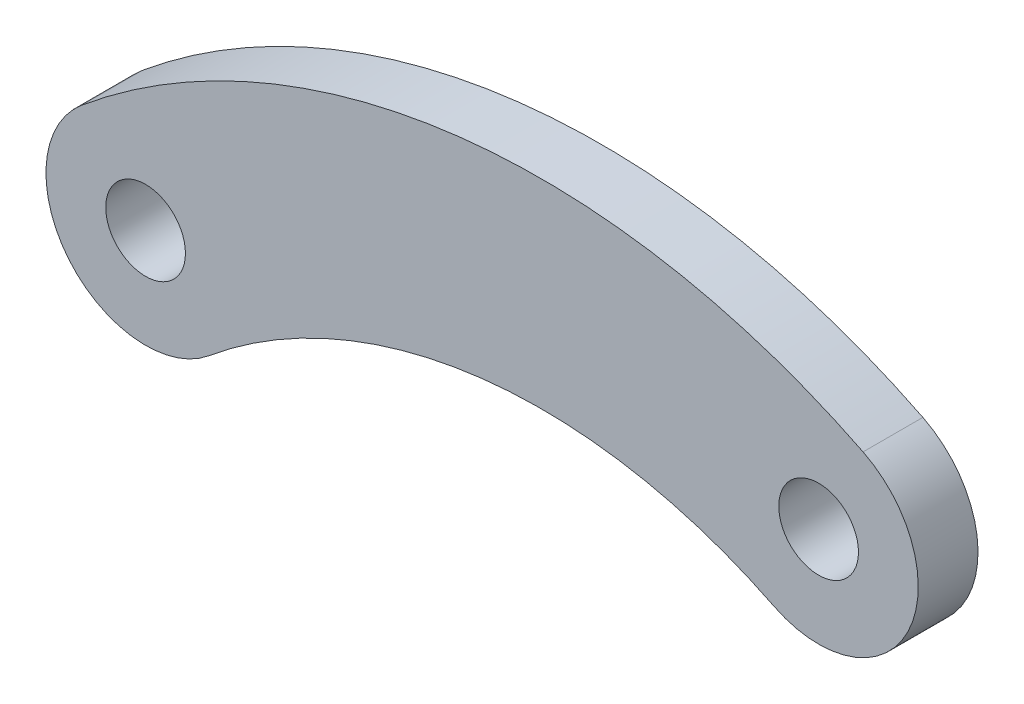
ISO-10303-21;
HEADER;
FILE_DESCRIPTION(('STEP AP214'),'2;1');
FILE_NAME('part.step','',(''),(''),'','','');
FILE_SCHEMA(('AUTOMOTIVE_DESIGN { 1 0 10303 214 1 1 1 1 }'));
ENDSEC;
DATA;
#1=APPLICATION_CONTEXT('core data for automotive mechanical design processes');
#2=APPLICATION_PROTOCOL_DEFINITION('international standard','automotive_design',2000,#1);
#3=PRODUCT_CONTEXT('',#1,'mechanical');
#4=PRODUCT('Part','Part','',(#3));
#5=PRODUCT_RELATED_PRODUCT_CATEGORY('part','',(#4));
#6=PRODUCT_DEFINITION_FORMATION('','',#4);
#7=PRODUCT_DEFINITION_CONTEXT('part definition',#1,'design');
#8=PRODUCT_DEFINITION('design','',#6,#7);
#9=PRODUCT_DEFINITION_SHAPE('','',#8);
#10=(LENGTH_UNIT() NAMED_UNIT(*) SI_UNIT(.MILLI.,.METRE.));
#11=(NAMED_UNIT(*) PLANE_ANGLE_UNIT() SI_UNIT($,.RADIAN.));
#12=(NAMED_UNIT(*) SI_UNIT($,.STERADIAN.) SOLID_ANGLE_UNIT());
#13=UNCERTAINTY_MEASURE_WITH_UNIT(LENGTH_MEASURE(1.E-05),#10,'distance_accuracy_value','');
#14=(GEOMETRIC_REPRESENTATION_CONTEXT(3) GLOBAL_UNCERTAINTY_ASSIGNED_CONTEXT((#13)) GLOBAL_UNIT_ASSIGNED_CONTEXT((#10,
#11,#12)) REPRESENTATION_CONTEXT('',''));
#15=CARTESIAN_POINT('',(0.,0.,0.));
#16=DIRECTION('',(0.,0.,1.));
#17=DIRECTION('',(1.,0.,0.));
#18=AXIS2_PLACEMENT_3D('',#15,#16,#17);
#19=CARTESIAN_POINT('',(13.4138493763877,-5.01133203779115,1.5));
#20=DIRECTION('',(0.,0.,1.));
#21=DIRECTION('',(1.,0.,0.));
#22=AXIS2_PLACEMENT_3D('',#19,#20,#21);
#23=PLANE('',#22);
#24=CARTESIAN_POINT('',(0.,0.,1.5));
#25=DIRECTION('',(0.,0.,1.));
#26=DIRECTION('',(1.,0.,0.));
#27=AXIS2_PLACEMENT_3D('',#24,#25,#26);
#28=CIRCLE('',#27,1.);
#29=CARTESIAN_POINT('',(1.,0.,1.5));
#30=VERTEX_POINT('',#29);
#31=EDGE_CURVE('E99',#30,#30,#28,.T.);
#32=ORIENTED_EDGE('',*,*,#31,.F.);
#33=EDGE_LOOP('',(#32));
#34=FACE_BOUND('',#33,.T.);
#35=CARTESIAN_POINT('',(16.8876471996402,1.95124884637647,1.5));
#36=DIRECTION('',(0.,0.,1.));
#37=DIRECTION('',(1.,0.,0.));
#38=AXIS2_PLACEMENT_3D('',#35,#36,#37);
#39=CIRCLE('',#38,2.5);
#40=CARTESIAN_POINT('',(15.7715394877083,-0.285781232850498,1.5));
#41=VERTEX_POINT('',#40);
#42=CARTESIAN_POINT('',(18.003754911572,4.18827892560344,1.5));
#43=VERTEX_POINT('',#42);
#44=EDGE_CURVE('E84',#41,#43,#39,.T.);
#45=ORIENTED_EDGE('',*,*,#44,.T.);
#46=CARTESIAN_POINT('',(9.94005155313531,-11.9739129219588,1.5));
#47=DIRECTION('',(0.,0.,1.));
#48=DIRECTION('',(1.,0.,0.));
#49=AXIS2_PLACEMENT_3D('',#46,#47,#48);
#50=CIRCLE('',#49,18.0621083257263);
#51=CARTESIAN_POINT('',(-1.59683561910167,1.92356856014237,1.5));
#52=VERTEX_POINT('',#51);
#53=EDGE_CURVE('E79',#43,#52,#50,.T.);
#54=ORIENTED_EDGE('',*,*,#53,.T.);
#55=CARTESIAN_POINT('',(0.,0.,1.5));
#56=DIRECTION('',(0.,0.,1.));
#57=DIRECTION('',(1.,0.,0.));
#58=AXIS2_PLACEMENT_3D('',#55,#56,#57);
#59=CIRCLE('',#58,2.5);
#60=CARTESIAN_POINT('',(1.59683561910166,-1.92356856014238,1.5));
#61=VERTEX_POINT('',#60);
#62=EDGE_CURVE('E82',#52,#61,#59,.T.);
#63=ORIENTED_EDGE('',*,*,#62,.T.);
#64=CARTESIAN_POINT('',(9.94005155313531,-11.9739129219588,1.5));
#65=DIRECTION('',(0.,0.,-1.));
#66=DIRECTION('',(1.,0.,0.));
#67=AXIS2_PLACEMENT_3D('',#64,#65,#66);
#68=CIRCLE('',#67,13.0621083257263);
#69=EDGE_CURVE('E49',#61,#41,#68,.T.);
#70=ORIENTED_EDGE('',*,*,#69,.T.);
#71=EDGE_LOOP('',(#45,#54,#63,#70));
#72=FACE_BOUND('',#71,.T.);
#73=CARTESIAN_POINT('',(16.8876471996402,1.95124884637647,1.5));
#74=DIRECTION('',(0.,0.,1.));
#75=DIRECTION('',(1.,0.,0.));
#76=AXIS2_PLACEMENT_3D('',#73,#74,#75);
#77=CIRCLE('',#76,1.);
#78=CARTESIAN_POINT('',(17.8876471996402,1.95124884637647,1.5));
#79=VERTEX_POINT('',#78);
#80=EDGE_CURVE('E114',#79,#79,#77,.T.);
#81=ORIENTED_EDGE('',*,*,#80,.F.);
#82=EDGE_LOOP('',(#81));
#83=FACE_BOUND('',#82,.T.);
#84=ADVANCED_FACE('F32',(#34,#72,#83),#23,.T.);
#85=CARTESIAN_POINT('',(13.4138493763877,-5.01133203779115,0.));
#86=DIRECTION('',(0.,0.,1.));
#87=DIRECTION('',(1.,0.,0.));
#88=AXIS2_PLACEMENT_3D('',#85,#86,#87);
#89=PLANE('',#88);
#90=CARTESIAN_POINT('',(16.8876471996402,1.95124884637647,0.));
#91=DIRECTION('',(0.,0.,1.));
#92=DIRECTION('',(1.,0.,0.));
#93=AXIS2_PLACEMENT_3D('',#90,#91,#92);
#94=CIRCLE('',#93,2.5);
#95=CARTESIAN_POINT('',(15.7715394877083,-0.285781232850498,0.));
#96=VERTEX_POINT('',#95);
#97=CARTESIAN_POINT('',(18.003754911572,4.18827892560344,0.));
#98=VERTEX_POINT('',#97);
#99=EDGE_CURVE('E96',#96,#98,#94,.T.);
#100=ORIENTED_EDGE('',*,*,#99,.F.);
#101=CARTESIAN_POINT('',(9.94005155313531,-11.9739129219588,0.));
#102=DIRECTION('',(0.,0.,-1.));
#103=DIRECTION('',(1.,0.,0.));
#104=AXIS2_PLACEMENT_3D('',#101,#102,#103);
#105=CIRCLE('',#104,13.0621083257263);
#106=CARTESIAN_POINT('',(1.59683561910166,-1.92356856014238,0.));
#107=VERTEX_POINT('',#106);
#108=EDGE_CURVE('E72',#107,#96,#105,.T.);
#109=ORIENTED_EDGE('',*,*,#108,.F.);
#110=CARTESIAN_POINT('',(0.,0.,0.));
#111=DIRECTION('',(0.,0.,1.));
#112=DIRECTION('',(1.,0.,0.));
#113=AXIS2_PLACEMENT_3D('',#110,#111,#112);
#114=CIRCLE('',#113,2.5);
#115=CARTESIAN_POINT('',(-1.59683561910167,1.92356856014237,0.));
#116=VERTEX_POINT('',#115);
#117=EDGE_CURVE('E66',#116,#107,#114,.T.);
#118=ORIENTED_EDGE('',*,*,#117,.F.);
#119=CARTESIAN_POINT('',(9.94005155313531,-11.9739129219588,0.));
#120=DIRECTION('',(0.,0.,1.));
#121=DIRECTION('',(1.,0.,0.));
#122=AXIS2_PLACEMENT_3D('',#119,#120,#121);
#123=CIRCLE('',#122,18.0621083257263);
#124=EDGE_CURVE('E88',#98,#116,#123,.T.);
#125=ORIENTED_EDGE('',*,*,#124,.F.);
#126=EDGE_LOOP('',(#100,#109,#118,#125));
#127=FACE_BOUND('',#126,.T.);
#128=CARTESIAN_POINT('',(0.,0.,0.));
#129=DIRECTION('',(0.,0.,1.));
#130=DIRECTION('',(1.,0.,0.));
#131=AXIS2_PLACEMENT_3D('',#128,#129,#130);
#132=CIRCLE('',#131,1.);
#133=CARTESIAN_POINT('',(1.,0.,0.));
#134=VERTEX_POINT('',#133);
#135=EDGE_CURVE('E111',#134,#134,#132,.T.);
#136=ORIENTED_EDGE('',*,*,#135,.T.);
#137=EDGE_LOOP('',(#136));
#138=FACE_BOUND('',#137,.T.);
#139=CARTESIAN_POINT('',(16.8876471996402,1.95124884637647,0.));
#140=DIRECTION('',(0.,0.,1.));
#141=DIRECTION('',(1.,0.,0.));
#142=AXIS2_PLACEMENT_3D('',#139,#140,#141);
#143=CIRCLE('',#142,1.);
#144=CARTESIAN_POINT('',(17.8876471996402,1.95124884637647,0.));
#145=VERTEX_POINT('',#144);
#146=EDGE_CURVE('E117',#145,#145,#143,.T.);
#147=ORIENTED_EDGE('',*,*,#146,.T.);
#148=EDGE_LOOP('',(#147));
#149=FACE_BOUND('',#148,.T.);
#150=ADVANCED_FACE('F107',(#127,#138,#149),#89,.F.);
#151=CARTESIAN_POINT('',(16.8876471996402,1.95124884637647,1.5));
#152=DIRECTION('',(0.,0.,-1.));
#153=DIRECTION('',(-1.,0.,0.));
#154=AXIS2_PLACEMENT_3D('',#151,#152,#153);
#155=CYLINDRICAL_SURFACE('',#154,2.5);
#156=ORIENTED_EDGE('',*,*,#99,.T.);
#157=DIRECTION('',(0.,0.,-1.));
#158=VECTOR('',#157,1.);
#159=CARTESIAN_POINT('',(18.003754911572,4.18827892560344,1.5));
#160=LINE('',#159,#158);
#161=EDGE_CURVE('E11',#43,#98,#160,.T.);
#162=ORIENTED_EDGE('',*,*,#161,.F.);
#163=ORIENTED_EDGE('',*,*,#44,.F.);
#164=DIRECTION('',(0.,0.,-1.));
#165=VECTOR('',#164,1.);
#166=CARTESIAN_POINT('',(15.7715394877083,-0.285781232850498,1.5));
#167=LINE('',#166,#165);
#168=EDGE_CURVE('E92',#41,#96,#167,.T.);
#169=ORIENTED_EDGE('',*,*,#168,.T.);
#170=EDGE_LOOP('',(#156,#162,#163,#169));
#171=FACE_BOUND('',#170,.T.);
#172=ADVANCED_FACE('F34',(#171),#155,.T.);
#173=CARTESIAN_POINT('',(9.94005155313531,-11.9739129219588,1.5));
#174=DIRECTION('',(0.,0.,-1.));
#175=DIRECTION('',(-1.,0.,0.));
#176=AXIS2_PLACEMENT_3D('',#173,#174,#175);
#177=CYLINDRICAL_SURFACE('',#176,18.0621083257263);
#178=ORIENTED_EDGE('',*,*,#124,.T.);
#179=DIRECTION('',(0.,0.,-1.));
#180=VECTOR('',#179,1.);
#181=CARTESIAN_POINT('',(-1.59683561910167,1.92356856014237,1.5));
#182=LINE('',#181,#180);
#183=EDGE_CURVE('E41',#52,#116,#182,.T.);
#184=ORIENTED_EDGE('',*,*,#183,.F.);
#185=ORIENTED_EDGE('',*,*,#53,.F.);
#186=ORIENTED_EDGE('',*,*,#161,.T.);
#187=EDGE_LOOP('',(#178,#184,#185,#186));
#188=FACE_BOUND('',#187,.T.);
#189=ADVANCED_FACE('F87',(#188),#177,.T.);
#190=CARTESIAN_POINT('',(0.,0.,1.5));
#191=DIRECTION('',(0.,0.,-1.));
#192=DIRECTION('',(-1.,0.,0.));
#193=AXIS2_PLACEMENT_3D('',#190,#191,#192);
#194=CYLINDRICAL_SURFACE('',#193,2.5);
#195=ORIENTED_EDGE('',*,*,#117,.T.);
#196=DIRECTION('',(0.,0.,-1.));
#197=VECTOR('',#196,1.);
#198=CARTESIAN_POINT('',(1.59683561910166,-1.92356856014238,1.5));
#199=LINE('',#198,#197);
#200=EDGE_CURVE('E89',#61,#107,#199,.T.);
#201=ORIENTED_EDGE('',*,*,#200,.F.);
#202=ORIENTED_EDGE('',*,*,#62,.F.);
#203=ORIENTED_EDGE('',*,*,#183,.T.);
#204=EDGE_LOOP('',(#195,#201,#202,#203));
#205=FACE_BOUND('',#204,.T.);
#206=ADVANCED_FACE('F90',(#205),#194,.T.);
#207=CARTESIAN_POINT('',(9.94005155313531,-11.9739129219588,1.5));
#208=DIRECTION('',(0.,0.,-1.));
#209=DIRECTION('',(-1.,0.,0.));
#210=AXIS2_PLACEMENT_3D('',#207,#208,#209);
#211=CYLINDRICAL_SURFACE('',#210,13.0621083257263);
#212=ORIENTED_EDGE('',*,*,#108,.T.);
#213=ORIENTED_EDGE('',*,*,#168,.F.);
#214=ORIENTED_EDGE('',*,*,#69,.F.);
#215=ORIENTED_EDGE('',*,*,#200,.T.);
#216=EDGE_LOOP('',(#212,#213,#214,#215));
#217=FACE_BOUND('',#216,.T.);
#218=ADVANCED_FACE('F104',(#217),#211,.F.);
#219=CARTESIAN_POINT('',(0.,0.,1.5));
#220=DIRECTION('',(0.,0.,-1.));
#221=DIRECTION('',(-1.,0.,0.));
#222=AXIS2_PLACEMENT_3D('',#219,#220,#221);
#223=CYLINDRICAL_SURFACE('',#222,1.);
#224=ORIENTED_EDGE('',*,*,#31,.T.);
#225=EDGE_LOOP('',(#224));
#226=FACE_BOUND('',#225,.T.);
#227=ORIENTED_EDGE('',*,*,#135,.F.);
#228=EDGE_LOOP('',(#227));
#229=FACE_BOUND('',#228,.T.);
#230=ADVANCED_FACE('F134',(#226,#229),#223,.F.);
#231=CARTESIAN_POINT('',(16.8876471996402,1.95124884637647,1.5));
#232=DIRECTION('',(0.,0.,-1.));
#233=DIRECTION('',(-1.,0.,0.));
#234=AXIS2_PLACEMENT_3D('',#231,#232,#233);
#235=CYLINDRICAL_SURFACE('',#234,1.);
#236=ORIENTED_EDGE('',*,*,#80,.T.);
#237=EDGE_LOOP('',(#236));
#238=FACE_BOUND('',#237,.T.);
#239=ORIENTED_EDGE('',*,*,#146,.F.);
#240=EDGE_LOOP('',(#239));
#241=FACE_BOUND('',#240,.T.);
#242=ADVANCED_FACE('F123',(#238,#241),#235,.F.);
#243=CLOSED_SHELL('',(#84,#150,#172,#189,#206,#218,#230,#242));
#244=MANIFOLD_SOLID_BREP('B2',#243);
#245=ADVANCED_BREP_SHAPE_REPRESENTATION('',(#18,#244),#14);
#246=SHAPE_DEFINITION_REPRESENTATION(#9,#245);
ENDSEC;
END-ISO-10303-21;
